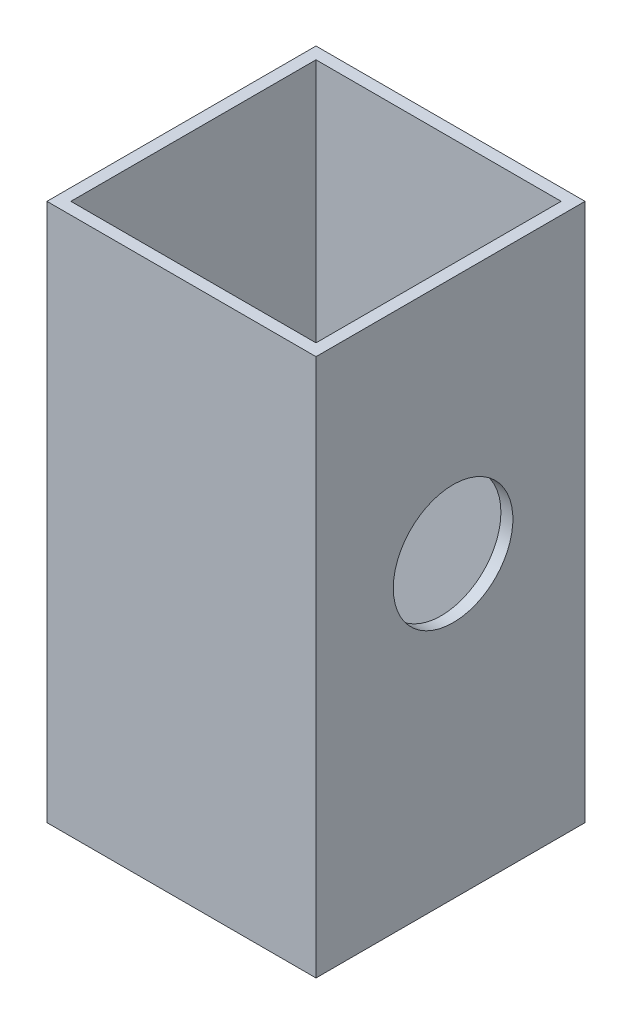
ISO-10303-21;
HEADER;
FILE_DESCRIPTION(('STEP AP214'),'2;1');
FILE_NAME('part.step','',(''),(''),'','','');
FILE_SCHEMA(('AUTOMOTIVE_DESIGN { 1 0 10303 214 1 1 1 1 }'));
ENDSEC;
DATA;
#1=APPLICATION_CONTEXT('core data for automotive mechanical design processes');
#2=APPLICATION_PROTOCOL_DEFINITION('international standard','automotive_design',2000,#1);
#3=PRODUCT_CONTEXT('',#1,'mechanical');
#4=PRODUCT('Part','Part','',(#3));
#5=PRODUCT_RELATED_PRODUCT_CATEGORY('part','',(#4));
#6=PRODUCT_DEFINITION_FORMATION('','',#4);
#7=PRODUCT_DEFINITION_CONTEXT('part definition',#1,'design');
#8=PRODUCT_DEFINITION('design','',#6,#7);
#9=PRODUCT_DEFINITION_SHAPE('','',#8);
#10=(LENGTH_UNIT() NAMED_UNIT(*) SI_UNIT(.MILLI.,.METRE.));
#11=(NAMED_UNIT(*) PLANE_ANGLE_UNIT() SI_UNIT($,.RADIAN.));
#12=(NAMED_UNIT(*) SI_UNIT($,.STERADIAN.) SOLID_ANGLE_UNIT());
#13=UNCERTAINTY_MEASURE_WITH_UNIT(LENGTH_MEASURE(1.E-05),#10,'distance_accuracy_value','');
#14=(GEOMETRIC_REPRESENTATION_CONTEXT(3) GLOBAL_UNCERTAINTY_ASSIGNED_CONTEXT((#13)) GLOBAL_UNIT_ASSIGNED_CONTEXT((#10,
#11,#12)) REPRESENTATION_CONTEXT('',''));
#15=CARTESIAN_POINT('',(0.,0.,0.));
#16=DIRECTION('',(0.,0.,1.));
#17=DIRECTION('',(1.,0.,0.));
#18=AXIS2_PLACEMENT_3D('',#15,#16,#17);
#19=CARTESIAN_POINT('',(0.,45.,0.));
#20=DIRECTION('',(-1.,0.,0.));
#21=DIRECTION('',(0.,0.,1.));
#22=AXIS2_PLACEMENT_3D('',#19,#20,#21);
#23=PLANE('',#22);
#24=CARTESIAN_POINT('',(0.,25.,11.0361110306243));
#25=DIRECTION('',(-1.,0.,0.));
#26=DIRECTION('',(0.,0.,1.));
#27=AXIS2_PLACEMENT_3D('',#24,#25,#26);
#28=CIRCLE('',#27,5.);
#29=CARTESIAN_POINT('',(0.,25.,16.0361110306243));
#30=VERTEX_POINT('',#29);
#31=EDGE_CURVE('E137',#30,#30,#28,.T.);
#32=ORIENTED_EDGE('',*,*,#31,.T.);
#33=EDGE_LOOP('',(#32));
#34=FACE_BOUND('',#33,.T.);
#35=DIRECTION('',(0.,0.,-1.));
#36=VECTOR('',#35,1.);
#37=CARTESIAN_POINT('',(0.,0.,0.));
#38=LINE('',#37,#36);
#39=CARTESIAN_POINT('',(0.,0.,22.5));
#40=VERTEX_POINT('',#39);
#41=CARTESIAN_POINT('',(0.,0.,0.));
#42=VERTEX_POINT('',#41);
#43=EDGE_CURVE('E149',#40,#42,#38,.T.);
#44=ORIENTED_EDGE('',*,*,#43,.T.);
#45=DIRECTION('',(0.,-1.,0.));
#46=VECTOR('',#45,1.);
#47=CARTESIAN_POINT('',(0.,45.,0.));
#48=LINE('',#47,#46);
#49=CARTESIAN_POINT('',(0.,45.,0.));
#50=VERTEX_POINT('',#49);
#51=EDGE_CURVE('E11',#50,#42,#48,.T.);
#52=ORIENTED_EDGE('',*,*,#51,.F.);
#53=DIRECTION('',(0.,0.,-1.));
#54=VECTOR('',#53,1.);
#55=CARTESIAN_POINT('',(0.,45.,0.));
#56=LINE('',#55,#54);
#57=CARTESIAN_POINT('',(0.,45.,22.5));
#58=VERTEX_POINT('',#57);
#59=EDGE_CURVE('E153',#58,#50,#56,.T.);
#60=ORIENTED_EDGE('',*,*,#59,.F.);
#61=DIRECTION('',(0.,-1.,0.));
#62=VECTOR('',#61,1.);
#63=CARTESIAN_POINT('',(0.,45.,22.5));
#64=LINE('',#63,#62);
#65=EDGE_CURVE('E159',#58,#40,#64,.T.);
#66=ORIENTED_EDGE('',*,*,#65,.T.);
#67=EDGE_LOOP('',(#44,#52,#60,#66));
#68=FACE_BOUND('',#67,.T.);
#69=ADVANCED_FACE('F37',(#34,#68),#23,.F.);
#70=CARTESIAN_POINT('',(0.,45.,0.));
#71=DIRECTION('',(0.,0.,1.));
#72=DIRECTION('',(1.,0.,0.));
#73=AXIS2_PLACEMENT_3D('',#70,#71,#72);
#74=PLANE('',#73);
#75=DIRECTION('',(-1.,0.,0.));
#76=VECTOR('',#75,1.);
#77=CARTESIAN_POINT('',(0.,0.,0.));
#78=LINE('',#77,#76);
#79=CARTESIAN_POINT('',(-22.5,0.,0.));
#80=VERTEX_POINT('',#79);
#81=EDGE_CURVE('E162',#42,#80,#78,.T.);
#82=ORIENTED_EDGE('',*,*,#81,.T.);
#83=DIRECTION('',(0.,-1.,0.));
#84=VECTOR('',#83,1.);
#85=CARTESIAN_POINT('',(-22.5,45.,0.));
#86=LINE('',#85,#84);
#87=CARTESIAN_POINT('',(-22.5,45.,0.));
#88=VERTEX_POINT('',#87);
#89=EDGE_CURVE('E45',#88,#80,#86,.T.);
#90=ORIENTED_EDGE('',*,*,#89,.F.);
#91=DIRECTION('',(-1.,0.,0.));
#92=VECTOR('',#91,1.);
#93=CARTESIAN_POINT('',(0.,45.,0.));
#94=LINE('',#93,#92);
#95=EDGE_CURVE('E89',#50,#88,#94,.T.);
#96=ORIENTED_EDGE('',*,*,#95,.F.);
#97=ORIENTED_EDGE('',*,*,#51,.T.);
#98=EDGE_LOOP('',(#82,#90,#96,#97));
#99=FACE_BOUND('',#98,.T.);
#100=ADVANCED_FACE('F192',(#99),#74,.F.);
#101=CARTESIAN_POINT('',(-22.5,45.,0.));
#102=DIRECTION('',(1.,0.,0.));
#103=DIRECTION('',(0.,0.,-1.));
#104=AXIS2_PLACEMENT_3D('',#101,#102,#103);
#105=PLANE('',#104);
#106=CARTESIAN_POINT('',(-22.5,25.,11.0361110306243));
#107=DIRECTION('',(-1.,0.,0.));
#108=DIRECTION('',(0.,0.,1.));
#109=AXIS2_PLACEMENT_3D('',#106,#107,#108);
#110=CIRCLE('',#109,5.);
#111=CARTESIAN_POINT('',(-22.5,25.,16.0361110306243));
#112=VERTEX_POINT('',#111);
#113=EDGE_CURVE('E209',#112,#112,#110,.T.);
#114=ORIENTED_EDGE('',*,*,#113,.F.);
#115=EDGE_LOOP('',(#114));
#116=FACE_BOUND('',#115,.T.);
#117=DIRECTION('',(0.,0.,1.));
#118=VECTOR('',#117,1.);
#119=CARTESIAN_POINT('',(-22.5,0.,0.));
#120=LINE('',#119,#118);
#121=CARTESIAN_POINT('',(-22.5,0.,22.5));
#122=VERTEX_POINT('',#121);
#123=EDGE_CURVE('E164',#80,#122,#120,.T.);
#124=ORIENTED_EDGE('',*,*,#123,.T.);
#125=DIRECTION('',(0.,-1.,0.));
#126=VECTOR('',#125,1.);
#127=CARTESIAN_POINT('',(-22.5,45.,22.5));
#128=LINE('',#127,#126);
#129=CARTESIAN_POINT('',(-22.5,45.,22.5));
#130=VERTEX_POINT('',#129);
#131=EDGE_CURVE('E168',#130,#122,#128,.T.);
#132=ORIENTED_EDGE('',*,*,#131,.F.);
#133=DIRECTION('',(0.,0.,1.));
#134=VECTOR('',#133,1.);
#135=CARTESIAN_POINT('',(-22.5,45.,0.));
#136=LINE('',#135,#134);
#137=EDGE_CURVE('E156',#88,#130,#136,.T.);
#138=ORIENTED_EDGE('',*,*,#137,.F.);
#139=ORIENTED_EDGE('',*,*,#89,.T.);
#140=EDGE_LOOP('',(#124,#132,#138,#139));
#141=FACE_BOUND('',#140,.T.);
#142=ADVANCED_FACE('F174',(#116,#141),#105,.F.);
#143=CARTESIAN_POINT('',(0.,45.,22.5));
#144=DIRECTION('',(0.,0.,-1.));
#145=DIRECTION('',(-1.,0.,0.));
#146=AXIS2_PLACEMENT_3D('',#143,#144,#145);
#147=PLANE('',#146);
#148=DIRECTION('',(1.,0.,0.));
#149=VECTOR('',#148,1.);
#150=CARTESIAN_POINT('',(0.,0.,22.5));
#151=LINE('',#150,#149);
#152=EDGE_CURVE('E82',#122,#40,#151,.T.);
#153=ORIENTED_EDGE('',*,*,#152,.T.);
#154=ORIENTED_EDGE('',*,*,#65,.F.);
#155=DIRECTION('',(1.,0.,0.));
#156=VECTOR('',#155,1.);
#157=CARTESIAN_POINT('',(0.,45.,22.5));
#158=LINE('',#157,#156);
#159=EDGE_CURVE('E61',#130,#58,#158,.T.);
#160=ORIENTED_EDGE('',*,*,#159,.F.);
#161=ORIENTED_EDGE('',*,*,#131,.T.);
#162=EDGE_LOOP('',(#153,#154,#160,#161));
#163=FACE_BOUND('',#162,.T.);
#164=ADVANCED_FACE('F182',(#163),#147,.F.);
#165=CARTESIAN_POINT('',(0.,45.,0.));
#166=DIRECTION('',(0.,-1.,0.));
#167=DIRECTION('',(0.,0.,-1.));
#168=AXIS2_PLACEMENT_3D('',#165,#166,#167);
#169=PLANE('',#168);
#170=DIRECTION('',(1.,0.,0.));
#171=VECTOR('',#170,1.);
#172=CARTESIAN_POINT('',(-21.5,45.,21.5));
#173=LINE('',#172,#171);
#174=CARTESIAN_POINT('',(-21.5,45.,21.5));
#175=VERTEX_POINT('',#174);
#176=CARTESIAN_POINT('',(-0.999999999999994,45.,21.5));
#177=VERTEX_POINT('',#176);
#178=EDGE_CURVE('E143',#175,#177,#173,.T.);
#179=ORIENTED_EDGE('',*,*,#178,.F.);
#180=DIRECTION('',(0.,0.,1.));
#181=VECTOR('',#180,1.);
#182=CARTESIAN_POINT('',(-21.5,45.,1.));
#183=LINE('',#182,#181);
#184=CARTESIAN_POINT('',(-21.5,45.,1.));
#185=VERTEX_POINT('',#184);
#186=EDGE_CURVE('E52',#185,#175,#183,.T.);
#187=ORIENTED_EDGE('',*,*,#186,.F.);
#188=DIRECTION('',(-1.,0.,0.));
#189=VECTOR('',#188,1.);
#190=CARTESIAN_POINT('',(-21.5,45.,1.));
#191=LINE('',#190,#189);
#192=CARTESIAN_POINT('',(-0.999999999999997,45.,1.));
#193=VERTEX_POINT('',#192);
#194=EDGE_CURVE('E131',#193,#185,#191,.T.);
#195=ORIENTED_EDGE('',*,*,#194,.F.);
#196=DIRECTION('',(0.,0.,-1.));
#197=VECTOR('',#196,1.);
#198=CARTESIAN_POINT('',(-0.999999999999997,45.,1.));
#199=LINE('',#198,#197);
#200=EDGE_CURVE('E134',#177,#193,#199,.T.);
#201=ORIENTED_EDGE('',*,*,#200,.F.);
#202=EDGE_LOOP('',(#179,#187,#195,#201));
#203=FACE_BOUND('',#202,.T.);
#204=ORIENTED_EDGE('',*,*,#59,.T.);
#205=ORIENTED_EDGE('',*,*,#95,.T.);
#206=ORIENTED_EDGE('',*,*,#137,.T.);
#207=ORIENTED_EDGE('',*,*,#159,.T.);
#208=EDGE_LOOP('',(#204,#205,#206,#207));
#209=FACE_BOUND('',#208,.T.);
#210=ADVANCED_FACE('F184',(#203,#209),#169,.F.);
#211=CARTESIAN_POINT('',(0.,0.,0.));
#212=DIRECTION('',(0.,-1.,0.));
#213=DIRECTION('',(0.,0.,-1.));
#214=AXIS2_PLACEMENT_3D('',#211,#212,#213);
#215=PLANE('',#214);
#216=ORIENTED_EDGE('',*,*,#43,.F.);
#217=ORIENTED_EDGE('',*,*,#152,.F.);
#218=ORIENTED_EDGE('',*,*,#123,.F.);
#219=ORIENTED_EDGE('',*,*,#81,.F.);
#220=EDGE_LOOP('',(#216,#217,#218,#219));
#221=FACE_BOUND('',#220,.T.);
#222=ADVANCED_FACE('F178',(#221),#215,.T.);
#223=CARTESIAN_POINT('',(-21.5,5.,1.));
#224=DIRECTION('',(-1.,0.,0.));
#225=DIRECTION('',(0.,0.,1.));
#226=AXIS2_PLACEMENT_3D('',#223,#224,#225);
#227=PLANE('',#226);
#228=CARTESIAN_POINT('',(-21.5,25.,11.0361110306243));
#229=DIRECTION('',(-1.,0.,0.));
#230=DIRECTION('',(0.,0.,1.));
#231=AXIS2_PLACEMENT_3D('',#228,#229,#230);
#232=CIRCLE('',#231,5.);
#233=CARTESIAN_POINT('',(-21.5,25.,16.0361110306243));
#234=VERTEX_POINT('',#233);
#235=EDGE_CURVE('E204',#234,#234,#232,.T.);
#236=ORIENTED_EDGE('',*,*,#235,.T.);
#237=EDGE_LOOP('',(#236));
#238=FACE_BOUND('',#237,.T.);
#239=ORIENTED_EDGE('',*,*,#186,.T.);
#240=DIRECTION('',(0.,1.,0.));
#241=VECTOR('',#240,1.);
#242=CARTESIAN_POINT('',(-21.5,5.,21.5));
#243=LINE('',#242,#241);
#244=CARTESIAN_POINT('',(-21.5,5.,21.5));
#245=VERTEX_POINT('',#244);
#246=EDGE_CURVE('E109',#245,#175,#243,.T.);
#247=ORIENTED_EDGE('',*,*,#246,.F.);
#248=DIRECTION('',(0.,0.,1.));
#249=VECTOR('',#248,1.);
#250=CARTESIAN_POINT('',(-21.5,5.,1.));
#251=LINE('',#250,#249);
#252=CARTESIAN_POINT('',(-21.5,5.,1.));
#253=VERTEX_POINT('',#252);
#254=EDGE_CURVE('E113',#253,#245,#251,.T.);
#255=ORIENTED_EDGE('',*,*,#254,.F.);
#256=DIRECTION('',(0.,1.,0.));
#257=VECTOR('',#256,1.);
#258=CARTESIAN_POINT('',(-21.5,5.,1.));
#259=LINE('',#258,#257);
#260=EDGE_CURVE('E147',#253,#185,#259,.T.);
#261=ORIENTED_EDGE('',*,*,#260,.T.);
#262=EDGE_LOOP('',(#239,#247,#255,#261));
#263=FACE_BOUND('',#262,.T.);
#264=ADVANCED_FACE('F111',(#238,#263),#227,.F.);
#265=CARTESIAN_POINT('',(-21.5,5.,1.));
#266=DIRECTION('',(0.,0.,-1.));
#267=DIRECTION('',(-1.,0.,0.));
#268=AXIS2_PLACEMENT_3D('',#265,#266,#267);
#269=PLANE('',#268);
#270=ORIENTED_EDGE('',*,*,#194,.T.);
#271=ORIENTED_EDGE('',*,*,#260,.F.);
#272=DIRECTION('',(-1.,0.,0.));
#273=VECTOR('',#272,1.);
#274=CARTESIAN_POINT('',(-21.5,5.,1.));
#275=LINE('',#274,#273);
#276=CARTESIAN_POINT('',(-0.999999999999997,5.,1.));
#277=VERTEX_POINT('',#276);
#278=EDGE_CURVE('E119',#277,#253,#275,.T.);
#279=ORIENTED_EDGE('',*,*,#278,.F.);
#280=DIRECTION('',(0.,1.,0.));
#281=VECTOR('',#280,1.);
#282=CARTESIAN_POINT('',(-0.999999999999997,5.,1.));
#283=LINE('',#282,#281);
#284=EDGE_CURVE('E150',#277,#193,#283,.T.);
#285=ORIENTED_EDGE('',*,*,#284,.T.);
#286=EDGE_LOOP('',(#270,#271,#279,#285));
#287=FACE_BOUND('',#286,.T.);
#288=ADVANCED_FACE('F226',(#287),#269,.F.);
#289=CARTESIAN_POINT('',(-0.999999999999997,5.,1.));
#290=DIRECTION('',(1.,0.,0.));
#291=DIRECTION('',(0.,0.,-1.));
#292=AXIS2_PLACEMENT_3D('',#289,#290,#291);
#293=PLANE('',#292);
#294=CARTESIAN_POINT('',(-0.999999999999994,25.,11.0361110306243));
#295=DIRECTION('',(1.,0.,0.));
#296=DIRECTION('',(0.,0.,-1.));
#297=AXIS2_PLACEMENT_3D('',#294,#295,#296);
#298=CIRCLE('',#297,5.);
#299=CARTESIAN_POINT('',(-0.999999999999995,25.,6.03611103062432));
#300=VERTEX_POINT('',#299);
#301=EDGE_CURVE('E40',#300,#300,#298,.T.);
#302=ORIENTED_EDGE('',*,*,#301,.T.);
#303=EDGE_LOOP('',(#302));
#304=FACE_BOUND('',#303,.T.);
#305=ORIENTED_EDGE('',*,*,#200,.T.);
#306=ORIENTED_EDGE('',*,*,#284,.F.);
#307=DIRECTION('',(0.,0.,-1.));
#308=VECTOR('',#307,1.);
#309=CARTESIAN_POINT('',(-0.999999999999997,5.,1.));
#310=LINE('',#309,#308);
#311=CARTESIAN_POINT('',(-0.999999999999994,5.,21.5));
#312=VERTEX_POINT('',#311);
#313=EDGE_CURVE('E127',#312,#277,#310,.T.);
#314=ORIENTED_EDGE('',*,*,#313,.F.);
#315=DIRECTION('',(0.,1.,0.));
#316=VECTOR('',#315,1.);
#317=CARTESIAN_POINT('',(-0.999999999999994,5.,21.5));
#318=LINE('',#317,#316);
#319=EDGE_CURVE('E118',#312,#177,#318,.T.);
#320=ORIENTED_EDGE('',*,*,#319,.T.);
#321=EDGE_LOOP('',(#305,#306,#314,#320));
#322=FACE_BOUND('',#321,.T.);
#323=ADVANCED_FACE('F229',(#304,#322),#293,.F.);
#324=CARTESIAN_POINT('',(-21.5,5.,21.5));
#325=DIRECTION('',(0.,0.,1.));
#326=DIRECTION('',(1.,0.,0.));
#327=AXIS2_PLACEMENT_3D('',#324,#325,#326);
#328=PLANE('',#327);
#329=ORIENTED_EDGE('',*,*,#178,.T.);
#330=ORIENTED_EDGE('',*,*,#319,.F.);
#331=DIRECTION('',(1.,0.,0.));
#332=VECTOR('',#331,1.);
#333=CARTESIAN_POINT('',(-21.5,5.,21.5));
#334=LINE('',#333,#332);
#335=EDGE_CURVE('E122',#245,#312,#334,.T.);
#336=ORIENTED_EDGE('',*,*,#335,.F.);
#337=ORIENTED_EDGE('',*,*,#246,.T.);
#338=EDGE_LOOP('',(#329,#330,#336,#337));
#339=FACE_BOUND('',#338,.T.);
#340=ADVANCED_FACE('F123',(#339),#328,.F.);
#341=CARTESIAN_POINT('',(0.,5.,0.));
#342=DIRECTION('',(0.,1.,0.));
#343=DIRECTION('',(0.,0.,1.));
#344=AXIS2_PLACEMENT_3D('',#341,#342,#343);
#345=PLANE('',#344);
#346=ORIENTED_EDGE('',*,*,#254,.T.);
#347=ORIENTED_EDGE('',*,*,#335,.T.);
#348=ORIENTED_EDGE('',*,*,#313,.T.);
#349=ORIENTED_EDGE('',*,*,#278,.T.);
#350=EDGE_LOOP('',(#346,#347,#348,#349));
#351=FACE_BOUND('',#350,.T.);
#352=ADVANCED_FACE('F129',(#351),#345,.T.);
#353=CARTESIAN_POINT('',(17.5,25.,11.0361110306243));
#354=DIRECTION('',(-1.,0.,0.));
#355=DIRECTION('',(0.,0.,1.));
#356=AXIS2_PLACEMENT_3D('',#353,#354,#355);
#357=CYLINDRICAL_SURFACE('',#356,5.);
#358=ORIENTED_EDGE('',*,*,#301,.F.);
#359=EDGE_LOOP('',(#358));
#360=FACE_BOUND('',#359,.T.);
#361=ORIENTED_EDGE('',*,*,#31,.F.);
#362=EDGE_LOOP('',(#361));
#363=FACE_BOUND('',#362,.T.);
#364=ADVANCED_FACE('F217',(#360,#363),#357,.F.);
#365=ORIENTED_EDGE('',*,*,#113,.T.);
#366=EDGE_LOOP('',(#365));
#367=FACE_BOUND('',#366,.T.);
#368=ORIENTED_EDGE('',*,*,#235,.F.);
#369=EDGE_LOOP('',(#368));
#370=FACE_BOUND('',#369,.T.);
#371=ADVANCED_FACE('F214',(#367,#370),#357,.F.);
#372=CLOSED_SHELL('',(#69,#100,#142,#164,#210,#222,#264,#288,#323,#340,#352,#364,#371));
#373=MANIFOLD_SOLID_BREP('B2',#372);
#374=ADVANCED_BREP_SHAPE_REPRESENTATION('',(#18,#373),#14);
#375=SHAPE_DEFINITION_REPRESENTATION(#9,#374);
ENDSEC;
END-ISO-10303-21;
